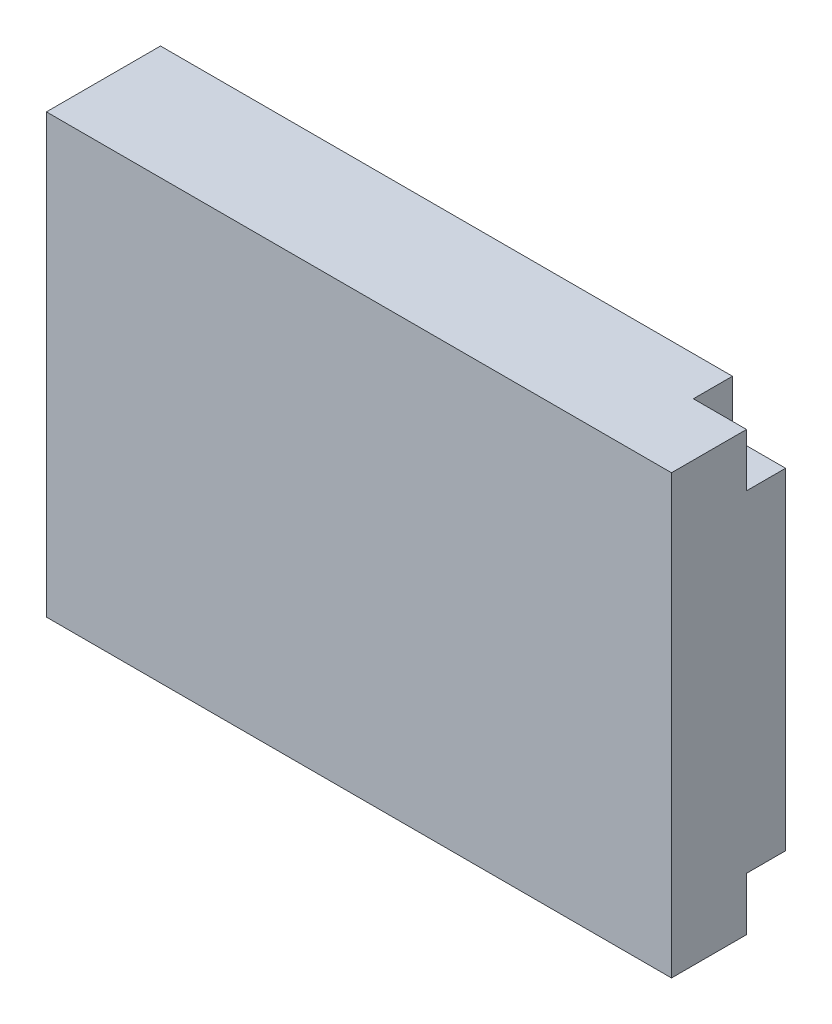
ISO-10303-21;
HEADER;
FILE_DESCRIPTION(('STEP AP214'),'2;1');
FILE_NAME('part.step','',(''),(''),'','','');
FILE_SCHEMA(('AUTOMOTIVE_DESIGN { 1 0 10303 214 1 1 1 1 }'));
ENDSEC;
DATA;
#1=APPLICATION_CONTEXT('core data for automotive mechanical design processes');
#2=APPLICATION_PROTOCOL_DEFINITION('international standard','automotive_design',2000,#1);
#3=PRODUCT_CONTEXT('',#1,'mechanical');
#4=PRODUCT('Part','Part','',(#3));
#5=PRODUCT_RELATED_PRODUCT_CATEGORY('part','',(#4));
#6=PRODUCT_DEFINITION_FORMATION('','',#4);
#7=PRODUCT_DEFINITION_CONTEXT('part definition',#1,'design');
#8=PRODUCT_DEFINITION('design','',#6,#7);
#9=PRODUCT_DEFINITION_SHAPE('','',#8);
#10=(LENGTH_UNIT() NAMED_UNIT(*) SI_UNIT(.MILLI.,.METRE.));
#11=(NAMED_UNIT(*) PLANE_ANGLE_UNIT() SI_UNIT($,.RADIAN.));
#12=(NAMED_UNIT(*) SI_UNIT($,.STERADIAN.) SOLID_ANGLE_UNIT());
#13=UNCERTAINTY_MEASURE_WITH_UNIT(LENGTH_MEASURE(1.E-05),#10,'distance_accuracy_value','');
#14=(GEOMETRIC_REPRESENTATION_CONTEXT(3) GLOBAL_UNCERTAINTY_ASSIGNED_CONTEXT((#13)) GLOBAL_UNIT_ASSIGNED_CONTEXT((#10,
#11,#12)) REPRESENTATION_CONTEXT('',''));
#15=CARTESIAN_POINT('',(0.,0.,0.));
#16=DIRECTION('',(0.,0.,1.));
#17=DIRECTION('',(1.,0.,0.));
#18=AXIS2_PLACEMENT_3D('',#15,#16,#17);
#19=CARTESIAN_POINT('',(10.,-7.,3.65));
#20=DIRECTION('',(-1.,0.,0.));
#21=DIRECTION('',(0.,0.,1.));
#22=AXIS2_PLACEMENT_3D('',#19,#20,#21);
#23=PLANE('',#22);
#24=DIRECTION('',(0.,0.,-1.));
#25=VECTOR('',#24,1.);
#26=CARTESIAN_POINT('',(10.,5.3,1.25));
#27=LINE('',#26,#25);
#28=CARTESIAN_POINT('',(10.,5.3,1.25));
#29=VERTEX_POINT('',#28);
#30=CARTESIAN_POINT('',(10.,5.3,0.));
#31=VERTEX_POINT('',#30);
#32=EDGE_CURVE('E61',#29,#31,#27,.T.);
#33=ORIENTED_EDGE('',*,*,#32,.F.);
#34=DIRECTION('',(0.,1.,0.));
#35=VECTOR('',#34,1.);
#36=CARTESIAN_POINT('',(10.,7.,1.25));
#37=LINE('',#36,#35);
#38=CARTESIAN_POINT('',(10.,7.,1.25));
#39=VERTEX_POINT('',#38);
#40=EDGE_CURVE('E122',#29,#39,#37,.T.);
#41=ORIENTED_EDGE('',*,*,#40,.T.);
#42=DIRECTION('',(0.,0.,-1.));
#43=VECTOR('',#42,1.);
#44=CARTESIAN_POINT('',(10.,7.,3.65));
#45=LINE('',#44,#43);
#46=CARTESIAN_POINT('',(10.,7.,3.65));
#47=VERTEX_POINT('',#46);
#48=EDGE_CURVE('E11',#47,#39,#45,.T.);
#49=ORIENTED_EDGE('',*,*,#48,.F.);
#50=DIRECTION('',(0.,1.,0.));
#51=VECTOR('',#50,1.);
#52=CARTESIAN_POINT('',(10.,-7.,3.65));
#53=LINE('',#52,#51);
#54=CARTESIAN_POINT('',(10.,-7.,3.65));
#55=VERTEX_POINT('',#54);
#56=EDGE_CURVE('E141',#55,#47,#53,.T.);
#57=ORIENTED_EDGE('',*,*,#56,.F.);
#58=DIRECTION('',(0.,0.,-1.));
#59=VECTOR('',#58,1.);
#60=CARTESIAN_POINT('',(10.,-7.,3.65));
#61=LINE('',#60,#59);
#62=CARTESIAN_POINT('',(10.,-7.,1.25));
#63=VERTEX_POINT('',#62);
#64=EDGE_CURVE('E159',#55,#63,#61,.T.);
#65=ORIENTED_EDGE('',*,*,#64,.T.);
#66=DIRECTION('',(0.,1.,0.));
#67=VECTOR('',#66,1.);
#68=CARTESIAN_POINT('',(10.,-7.,1.25));
#69=LINE('',#68,#67);
#70=CARTESIAN_POINT('',(10.,-5.3,1.25));
#71=VERTEX_POINT('',#70);
#72=EDGE_CURVE('E154',#63,#71,#69,.T.);
#73=ORIENTED_EDGE('',*,*,#72,.T.);
#74=DIRECTION('',(0.,0.,-1.));
#75=VECTOR('',#74,1.);
#76=CARTESIAN_POINT('',(10.,-5.3,1.25));
#77=LINE('',#76,#75);
#78=CARTESIAN_POINT('',(10.,-5.3,0.));
#79=VERTEX_POINT('',#78);
#80=EDGE_CURVE('E188',#71,#79,#77,.T.);
#81=ORIENTED_EDGE('',*,*,#80,.T.);
#82=DIRECTION('',(0.,1.,0.));
#83=VECTOR('',#82,1.);
#84=CARTESIAN_POINT('',(10.,-7.,0.));
#85=LINE('',#84,#83);
#86=EDGE_CURVE('E160',#79,#31,#85,.T.);
#87=ORIENTED_EDGE('',*,*,#86,.T.);
#88=EDGE_LOOP('',(#33,#41,#49,#57,#65,#73,#81,#87));
#89=FACE_BOUND('',#88,.T.);
#90=ADVANCED_FACE('F39',(#89),#23,.F.);
#91=CARTESIAN_POINT('',(-10.,7.,3.65));
#92=DIRECTION('',(0.,-1.,0.));
#93=DIRECTION('',(0.,0.,-1.));
#94=AXIS2_PLACEMENT_3D('',#91,#92,#93);
#95=PLANE('',#94);
#96=DIRECTION('',(0.,0.,-1.));
#97=VECTOR('',#96,1.);
#98=CARTESIAN_POINT('',(8.3,7.,1.25));
#99=LINE('',#98,#97);
#100=CARTESIAN_POINT('',(8.3,7.,1.25));
#101=VERTEX_POINT('',#100);
#102=CARTESIAN_POINT('',(8.3,7.,0.));
#103=VERTEX_POINT('',#102);
#104=EDGE_CURVE('E163',#101,#103,#99,.T.);
#105=ORIENTED_EDGE('',*,*,#104,.T.);
#106=DIRECTION('',(-1.,0.,0.));
#107=VECTOR('',#106,1.);
#108=CARTESIAN_POINT('',(-10.,7.,0.));
#109=LINE('',#108,#107);
#110=CARTESIAN_POINT('',(-10.,7.,0.));
#111=VERTEX_POINT('',#110);
#112=EDGE_CURVE('E162',#103,#111,#109,.T.);
#113=ORIENTED_EDGE('',*,*,#112,.T.);
#114=DIRECTION('',(0.,0.,-1.));
#115=VECTOR('',#114,1.);
#116=CARTESIAN_POINT('',(-10.,7.,3.65));
#117=LINE('',#116,#115);
#118=CARTESIAN_POINT('',(-10.,7.,3.65));
#119=VERTEX_POINT('',#118);
#120=EDGE_CURVE('E46',#119,#111,#117,.T.);
#121=ORIENTED_EDGE('',*,*,#120,.F.);
#122=DIRECTION('',(-1.,0.,0.));
#123=VECTOR('',#122,1.);
#124=CARTESIAN_POINT('',(-10.,7.,3.65));
#125=LINE('',#124,#123);
#126=EDGE_CURVE('E135',#47,#119,#125,.T.);
#127=ORIENTED_EDGE('',*,*,#126,.F.);
#128=ORIENTED_EDGE('',*,*,#48,.T.);
#129=DIRECTION('',(-1.,0.,0.));
#130=VECTOR('',#129,1.);
#131=CARTESIAN_POINT('',(10.,7.,1.25));
#132=LINE('',#131,#130);
#133=EDGE_CURVE('E118',#39,#101,#132,.T.);
#134=ORIENTED_EDGE('',*,*,#133,.T.);
#135=EDGE_LOOP('',(#105,#113,#121,#127,#128,#134));
#136=FACE_BOUND('',#135,.T.);
#137=ADVANCED_FACE('F133',(#136),#95,.F.);
#138=CARTESIAN_POINT('',(-10.,-7.,3.65));
#139=DIRECTION('',(0.,1.,0.));
#140=DIRECTION('',(0.,0.,1.));
#141=AXIS2_PLACEMENT_3D('',#138,#139,#140);
#142=PLANE('',#141);
#143=DIRECTION('',(0.,0.,-1.));
#144=VECTOR('',#143,1.);
#145=CARTESIAN_POINT('',(8.3,-7.,1.25));
#146=LINE('',#145,#144);
#147=CARTESIAN_POINT('',(8.3,-7.,1.25));
#148=VERTEX_POINT('',#147);
#149=CARTESIAN_POINT('',(8.3,-7.,0.));
#150=VERTEX_POINT('',#149);
#151=EDGE_CURVE('E53',#148,#150,#146,.T.);
#152=ORIENTED_EDGE('',*,*,#151,.F.);
#153=DIRECTION('',(1.,0.,0.));
#154=VECTOR('',#153,1.);
#155=CARTESIAN_POINT('',(10.,-7.,1.25));
#156=LINE('',#155,#154);
#157=EDGE_CURVE('E184',#148,#63,#156,.T.);
#158=ORIENTED_EDGE('',*,*,#157,.T.);
#159=ORIENTED_EDGE('',*,*,#64,.F.);
#160=DIRECTION('',(1.,0.,0.));
#161=VECTOR('',#160,1.);
#162=CARTESIAN_POINT('',(-10.,-7.,3.65));
#163=LINE('',#162,#161);
#164=CARTESIAN_POINT('',(-10.,-7.,3.65));
#165=VERTEX_POINT('',#164);
#166=EDGE_CURVE('E145',#165,#55,#163,.T.);
#167=ORIENTED_EDGE('',*,*,#166,.F.);
#168=DIRECTION('',(0.,0.,-1.));
#169=VECTOR('',#168,1.);
#170=CARTESIAN_POINT('',(-10.,-7.,3.65));
#171=LINE('',#170,#169);
#172=CARTESIAN_POINT('',(-10.,-7.,0.));
#173=VERTEX_POINT('',#172);
#174=EDGE_CURVE('E167',#165,#173,#171,.T.);
#175=ORIENTED_EDGE('',*,*,#174,.T.);
#176=DIRECTION('',(1.,0.,0.));
#177=VECTOR('',#176,1.);
#178=CARTESIAN_POINT('',(-10.,-7.,0.));
#179=LINE('',#178,#177);
#180=EDGE_CURVE('E148',#173,#150,#179,.T.);
#181=ORIENTED_EDGE('',*,*,#180,.T.);
#182=EDGE_LOOP('',(#152,#158,#159,#167,#175,#181));
#183=FACE_BOUND('',#182,.T.);
#184=ADVANCED_FACE('F181',(#183),#142,.F.);
#185=CARTESIAN_POINT('',(0.,0.,0.));
#186=DIRECTION('',(0.,0.,-1.));
#187=DIRECTION('',(-1.,0.,0.));
#188=AXIS2_PLACEMENT_3D('',#185,#186,#187);
#189=PLANE('',#188);
#190=ORIENTED_EDGE('',*,*,#112,.F.);
#191=DIRECTION('',(0.,-1.,0.));
#192=VECTOR('',#191,1.);
#193=CARTESIAN_POINT('',(8.3,7.,0.));
#194=LINE('',#193,#192);
#195=CARTESIAN_POINT('',(8.3,5.3,0.));
#196=VERTEX_POINT('',#195);
#197=EDGE_CURVE('E200',#103,#196,#194,.T.);
#198=ORIENTED_EDGE('',*,*,#197,.T.);
#199=DIRECTION('',(1.,0.,0.));
#200=VECTOR('',#199,1.);
#201=CARTESIAN_POINT('',(10.,5.3,0.));
#202=LINE('',#201,#200);
#203=EDGE_CURVE('E131',#196,#31,#202,.T.);
#204=ORIENTED_EDGE('',*,*,#203,.T.);
#205=ORIENTED_EDGE('',*,*,#86,.F.);
#206=DIRECTION('',(-1.,0.,0.));
#207=VECTOR('',#206,1.);
#208=CARTESIAN_POINT('',(10.,-5.3,0.));
#209=LINE('',#208,#207);
#210=CARTESIAN_POINT('',(8.3,-5.3,0.));
#211=VERTEX_POINT('',#210);
#212=EDGE_CURVE('E192',#79,#211,#209,.T.);
#213=ORIENTED_EDGE('',*,*,#212,.T.);
#214=DIRECTION('',(0.,-1.,0.));
#215=VECTOR('',#214,1.);
#216=CARTESIAN_POINT('',(8.3,-7.,0.));
#217=LINE('',#216,#215);
#218=EDGE_CURVE('E179',#211,#150,#217,.T.);
#219=ORIENTED_EDGE('',*,*,#218,.T.);
#220=ORIENTED_EDGE('',*,*,#180,.F.);
#221=DIRECTION('',(0.,-1.,0.));
#222=VECTOR('',#221,1.);
#223=CARTESIAN_POINT('',(-10.,-7.,0.));
#224=LINE('',#223,#222);
#225=EDGE_CURVE('E151',#111,#173,#224,.T.);
#226=ORIENTED_EDGE('',*,*,#225,.F.);
#227=EDGE_LOOP('',(#190,#198,#204,#205,#213,#219,#220,#226));
#228=FACE_BOUND('',#227,.T.);
#229=ADVANCED_FACE('F176',(#228),#189,.T.);
#230=CARTESIAN_POINT('',(-10.,-7.,3.65));
#231=DIRECTION('',(1.,0.,0.));
#232=DIRECTION('',(0.,0.,-1.));
#233=AXIS2_PLACEMENT_3D('',#230,#231,#232);
#234=PLANE('',#233);
#235=ORIENTED_EDGE('',*,*,#225,.T.);
#236=ORIENTED_EDGE('',*,*,#174,.F.);
#237=DIRECTION('',(0.,-1.,0.));
#238=VECTOR('',#237,1.);
#239=CARTESIAN_POINT('',(-10.,-7.,3.65));
#240=LINE('',#239,#238);
#241=EDGE_CURVE('E140',#119,#165,#240,.T.);
#242=ORIENTED_EDGE('',*,*,#241,.F.);
#243=ORIENTED_EDGE('',*,*,#120,.T.);
#244=EDGE_LOOP('',(#235,#236,#242,#243));
#245=FACE_BOUND('',#244,.T.);
#246=ADVANCED_FACE('F171',(#245),#234,.F.);
#247=CARTESIAN_POINT('',(0.,0.,3.65));
#248=DIRECTION('',(0.,0.,-1.));
#249=DIRECTION('',(-1.,0.,0.));
#250=AXIS2_PLACEMENT_3D('',#247,#248,#249);
#251=PLANE('',#250);
#252=ORIENTED_EDGE('',*,*,#56,.T.);
#253=ORIENTED_EDGE('',*,*,#126,.T.);
#254=ORIENTED_EDGE('',*,*,#241,.T.);
#255=ORIENTED_EDGE('',*,*,#166,.T.);
#256=EDGE_LOOP('',(#252,#253,#254,#255));
#257=FACE_BOUND('',#256,.T.);
#258=ADVANCED_FACE('F143',(#257),#251,.F.);
#259=CARTESIAN_POINT('',(10.,-5.3,1.25));
#260=DIRECTION('',(0.,-1.,0.));
#261=DIRECTION('',(0.,0.,-1.));
#262=AXIS2_PLACEMENT_3D('',#259,#260,#261);
#263=PLANE('',#262);
#264=ORIENTED_EDGE('',*,*,#212,.F.);
#265=ORIENTED_EDGE('',*,*,#80,.F.);
#266=DIRECTION('',(-1.,0.,0.));
#267=VECTOR('',#266,1.);
#268=CARTESIAN_POINT('',(10.,-5.3,1.25));
#269=LINE('',#268,#267);
#270=CARTESIAN_POINT('',(8.3,-5.3,1.25));
#271=VERTEX_POINT('',#270);
#272=EDGE_CURVE('E191',#71,#271,#269,.T.);
#273=ORIENTED_EDGE('',*,*,#272,.T.);
#274=DIRECTION('',(0.,0.,-1.));
#275=VECTOR('',#274,1.);
#276=CARTESIAN_POINT('',(8.3,-5.3,1.25));
#277=LINE('',#276,#275);
#278=EDGE_CURVE('E203',#271,#211,#277,.T.);
#279=ORIENTED_EDGE('',*,*,#278,.T.);
#280=EDGE_LOOP('',(#264,#265,#273,#279));
#281=FACE_BOUND('',#280,.T.);
#282=ADVANCED_FACE('F218',(#281),#263,.T.);
#283=CARTESIAN_POINT('',(8.3,-7.,1.25));
#284=DIRECTION('',(1.,0.,0.));
#285=DIRECTION('',(0.,1.,0.));
#286=AXIS2_PLACEMENT_3D('',#283,#284,#285);
#287=PLANE('',#286);
#288=ORIENTED_EDGE('',*,*,#218,.F.);
#289=ORIENTED_EDGE('',*,*,#278,.F.);
#290=DIRECTION('',(0.,-1.,0.));
#291=VECTOR('',#290,1.);
#292=CARTESIAN_POINT('',(8.3,-7.,1.25));
#293=LINE('',#292,#291);
#294=EDGE_CURVE('E194',#271,#148,#293,.T.);
#295=ORIENTED_EDGE('',*,*,#294,.T.);
#296=ORIENTED_EDGE('',*,*,#151,.T.);
#297=EDGE_LOOP('',(#288,#289,#295,#296));
#298=FACE_BOUND('',#297,.T.);
#299=ADVANCED_FACE('F220',(#298),#287,.T.);
#300=CARTESIAN_POINT('',(0.,0.,1.25));
#301=DIRECTION('',(0.,0.,1.));
#302=DIRECTION('',(1.,0.,0.));
#303=AXIS2_PLACEMENT_3D('',#300,#301,#302);
#304=PLANE('',#303);
#305=ORIENTED_EDGE('',*,*,#72,.F.);
#306=ORIENTED_EDGE('',*,*,#157,.F.);
#307=ORIENTED_EDGE('',*,*,#294,.F.);
#308=ORIENTED_EDGE('',*,*,#272,.F.);
#309=EDGE_LOOP('',(#305,#306,#307,#308));
#310=FACE_BOUND('',#309,.T.);
#311=ADVANCED_FACE('F222',(#310),#304,.F.);
#312=CARTESIAN_POINT('',(8.3,7.,1.25));
#313=DIRECTION('',(1.,0.,0.));
#314=DIRECTION('',(0.,0.,-1.));
#315=AXIS2_PLACEMENT_3D('',#312,#313,#314);
#316=PLANE('',#315);
#317=ORIENTED_EDGE('',*,*,#197,.F.);
#318=ORIENTED_EDGE('',*,*,#104,.F.);
#319=DIRECTION('',(0.,-1.,0.));
#320=VECTOR('',#319,1.);
#321=CARTESIAN_POINT('',(8.3,7.,1.25));
#322=LINE('',#321,#320);
#323=CARTESIAN_POINT('',(8.3,5.3,1.25));
#324=VERTEX_POINT('',#323);
#325=EDGE_CURVE('E123',#101,#324,#322,.T.);
#326=ORIENTED_EDGE('',*,*,#325,.T.);
#327=DIRECTION('',(0.,0.,-1.));
#328=VECTOR('',#327,1.);
#329=CARTESIAN_POINT('',(8.3,5.3,1.25));
#330=LINE('',#329,#328);
#331=EDGE_CURVE('E207',#324,#196,#330,.T.);
#332=ORIENTED_EDGE('',*,*,#331,.T.);
#333=EDGE_LOOP('',(#317,#318,#326,#332));
#334=FACE_BOUND('',#333,.T.);
#335=ADVANCED_FACE('F216',(#334),#316,.T.);
#336=CARTESIAN_POINT('',(10.,5.3,1.25));
#337=DIRECTION('',(0.,1.,0.));
#338=DIRECTION('',(0.,0.,1.));
#339=AXIS2_PLACEMENT_3D('',#336,#337,#338);
#340=PLANE('',#339);
#341=ORIENTED_EDGE('',*,*,#203,.F.);
#342=ORIENTED_EDGE('',*,*,#331,.F.);
#343=DIRECTION('',(1.,0.,0.));
#344=VECTOR('',#343,1.);
#345=CARTESIAN_POINT('',(10.,5.3,1.25));
#346=LINE('',#345,#344);
#347=EDGE_CURVE('E210',#324,#29,#346,.T.);
#348=ORIENTED_EDGE('',*,*,#347,.T.);
#349=ORIENTED_EDGE('',*,*,#32,.T.);
#350=EDGE_LOOP('',(#341,#342,#348,#349));
#351=FACE_BOUND('',#350,.T.);
#352=ADVANCED_FACE('F217',(#351),#340,.T.);
#353=CARTESIAN_POINT('',(0.,0.,1.25));
#354=DIRECTION('',(0.,0.,-1.));
#355=DIRECTION('',(-1.,0.,0.));
#356=AXIS2_PLACEMENT_3D('',#353,#354,#355);
#357=PLANE('',#356);
#358=ORIENTED_EDGE('',*,*,#40,.F.);
#359=ORIENTED_EDGE('',*,*,#347,.F.);
#360=ORIENTED_EDGE('',*,*,#325,.F.);
#361=ORIENTED_EDGE('',*,*,#133,.F.);
#362=EDGE_LOOP('',(#358,#359,#360,#361));
#363=FACE_BOUND('',#362,.T.);
#364=ADVANCED_FACE('F120',(#363),#357,.T.);
#365=CLOSED_SHELL('',(#90,#137,#184,#229,#246,#258,#282,#299,#311,#335,#352,#364));
#366=MANIFOLD_SOLID_BREP('B2',#365);
#367=ADVANCED_BREP_SHAPE_REPRESENTATION('',(#18,#366),#14);
#368=SHAPE_DEFINITION_REPRESENTATION(#9,#367);
ENDSEC;
END-ISO-10303-21;
